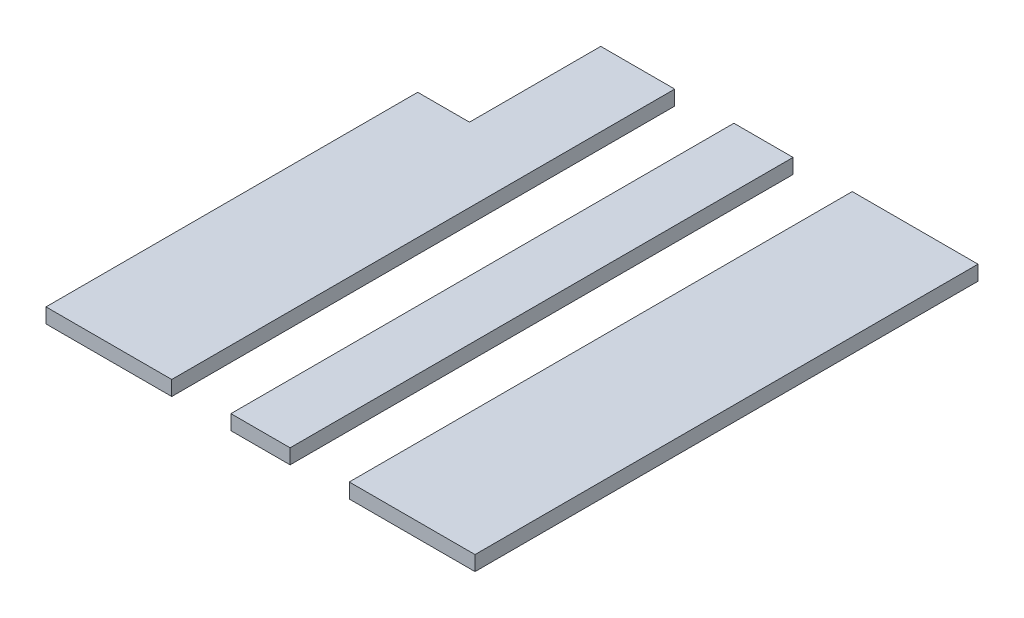
ISO-10303-21;
HEADER;
FILE_DESCRIPTION(('STEP AP214'),'2;1');
FILE_NAME('part.step','',(''),(''),'','','');
FILE_SCHEMA(('AUTOMOTIVE_DESIGN { 1 0 10303 214 1 1 1 1 }'));
ENDSEC;
DATA;
#1=APPLICATION_CONTEXT('core data for automotive mechanical design processes');
#2=APPLICATION_PROTOCOL_DEFINITION('international standard','automotive_design',2000,#1);
#3=PRODUCT_CONTEXT('',#1,'mechanical');
#4=PRODUCT('Part','Part','',(#3));
#5=PRODUCT_RELATED_PRODUCT_CATEGORY('part','',(#4));
#6=PRODUCT_DEFINITION_FORMATION('','',#4);
#7=PRODUCT_DEFINITION_CONTEXT('part definition',#1,'design');
#8=PRODUCT_DEFINITION('design','',#6,#7);
#9=PRODUCT_DEFINITION_SHAPE('','',#8);
#10=(LENGTH_UNIT() NAMED_UNIT(*) SI_UNIT(.MILLI.,.METRE.));
#11=(NAMED_UNIT(*) PLANE_ANGLE_UNIT() SI_UNIT($,.RADIAN.));
#12=(NAMED_UNIT(*) SI_UNIT($,.STERADIAN.) SOLID_ANGLE_UNIT());
#13=UNCERTAINTY_MEASURE_WITH_UNIT(LENGTH_MEASURE(1.E-05),#10,'distance_accuracy_value','');
#14=(GEOMETRIC_REPRESENTATION_CONTEXT(3) GLOBAL_UNCERTAINTY_ASSIGNED_CONTEXT((#13)) GLOBAL_UNIT_ASSIGNED_CONTEXT((#10,
#11,#12)) REPRESENTATION_CONTEXT('',''));
#15=CARTESIAN_POINT('',(0.,0.,0.));
#16=DIRECTION('',(0.,0.,1.));
#17=DIRECTION('',(1.,0.,0.));
#18=AXIS2_PLACEMENT_3D('',#15,#16,#17);
#19=CARTESIAN_POINT('',(-180.975,12.7,-469.9));
#20=DIRECTION('',(0.,0.,1.));
#21=DIRECTION('',(1.,0.,0.));
#22=AXIS2_PLACEMENT_3D('',#19,#20,#21);
#23=PLANE('',#22);
#24=DIRECTION('',(0.,1.,0.));
#25=VECTOR('',#24,1.);
#26=CARTESIAN_POINT('',(25.4000000000001,12.7,-469.9));
#27=LINE('',#26,#25);
#28=CARTESIAN_POINT('',(25.4000000000001,0.,-469.9));
#29=VERTEX_POINT('',#28);
#30=CARTESIAN_POINT('',(25.4000000000001,12.7,-469.9));
#31=VERTEX_POINT('',#30);
#32=EDGE_CURVE('E12',#29,#31,#27,.T.);
#33=ORIENTED_EDGE('',*,*,#32,.F.);
#34=DIRECTION('',(-1.,0.,0.));
#35=VECTOR('',#34,1.);
#36=CARTESIAN_POINT('',(-180.975,0.,-469.9));
#37=LINE('',#36,#35);
#38=CARTESIAN_POINT('',(-25.4000000000002,0.,-469.9));
#39=VERTEX_POINT('',#38);
#40=EDGE_CURVE('E100',#29,#39,#37,.T.);
#41=ORIENTED_EDGE('',*,*,#40,.T.);
#42=DIRECTION('',(0.,1.,0.));
#43=VECTOR('',#42,1.);
#44=CARTESIAN_POINT('',(-25.4000000000002,12.7,-469.9));
#45=LINE('',#44,#43);
#46=CARTESIAN_POINT('',(-25.4000000000002,12.7,-469.9));
#47=VERTEX_POINT('',#46);
#48=EDGE_CURVE('E92',#39,#47,#45,.T.);
#49=ORIENTED_EDGE('',*,*,#48,.T.);
#50=DIRECTION('',(-1.,0.,0.));
#51=VECTOR('',#50,1.);
#52=CARTESIAN_POINT('',(180.975,12.7,-469.9));
#53=LINE('',#52,#51);
#54=EDGE_CURVE('E87',#31,#47,#53,.T.);
#55=ORIENTED_EDGE('',*,*,#54,.F.);
#56=EDGE_LOOP('',(#33,#41,#49,#55));
#57=FACE_BOUND('',#56,.T.);
#58=ADVANCED_FACE('F41',(#57),#23,.F.);
#59=CARTESIAN_POINT('',(-231.560967647059,12.7,-38.1));
#60=DIRECTION('',(0.,0.,1.));
#61=DIRECTION('',(1.,0.,0.));
#62=AXIS2_PLACEMENT_3D('',#59,#60,#61);
#63=PLANE('',#62);
#64=DIRECTION('',(1.,0.,0.));
#65=VECTOR('',#64,1.);
#66=CARTESIAN_POINT('',(180.975,0.,-38.1));
#67=LINE('',#66,#65);
#68=CARTESIAN_POINT('',(-25.4000000000001,0.,-38.1));
#69=VERTEX_POINT('',#68);
#70=CARTESIAN_POINT('',(25.4000000000001,0.,-38.1));
#71=VERTEX_POINT('',#70);
#72=EDGE_CURVE('E98',#69,#71,#67,.T.);
#73=ORIENTED_EDGE('',*,*,#72,.T.);
#74=DIRECTION('',(0.,1.,0.));
#75=VECTOR('',#74,1.);
#76=CARTESIAN_POINT('',(25.4000000000001,12.7,-38.1));
#77=LINE('',#76,#75);
#78=CARTESIAN_POINT('',(25.4000000000001,12.7,-38.1));
#79=VERTEX_POINT('',#78);
#80=EDGE_CURVE('E61',#71,#79,#77,.T.);
#81=ORIENTED_EDGE('',*,*,#80,.T.);
#82=DIRECTION('',(-1.,0.,0.));
#83=VECTOR('',#82,1.);
#84=CARTESIAN_POINT('',(-231.560967647059,12.7,-38.1));
#85=LINE('',#84,#83);
#86=CARTESIAN_POINT('',(-25.4000000000001,12.7,-38.1));
#87=VERTEX_POINT('',#86);
#88=EDGE_CURVE('E44',#79,#87,#85,.T.);
#89=ORIENTED_EDGE('',*,*,#88,.T.);
#90=DIRECTION('',(0.,1.,0.));
#91=VECTOR('',#90,1.);
#92=CARTESIAN_POINT('',(-25.4000000000001,12.7,-38.1));
#93=LINE('',#92,#91);
#94=EDGE_CURVE('E49',#69,#87,#93,.T.);
#95=ORIENTED_EDGE('',*,*,#94,.F.);
#96=EDGE_LOOP('',(#73,#81,#89,#95));
#97=FACE_BOUND('',#96,.T.);
#98=ADVANCED_FACE('F111',(#97),#63,.T.);
#99=CARTESIAN_POINT('',(180.975,0.,-15.875));
#100=DIRECTION('',(0.,1.,0.));
#101=DIRECTION('',(0.,0.,1.));
#102=AXIS2_PLACEMENT_3D('',#99,#100,#101);
#103=PLANE('',#102);
#104=DIRECTION('',(0.,0.,1.));
#105=VECTOR('',#104,1.);
#106=CARTESIAN_POINT('',(25.4000000000001,0.,-486.780807022428));
#107=LINE('',#106,#105);
#108=EDGE_CURVE('E56',#29,#71,#107,.T.);
#109=ORIENTED_EDGE('',*,*,#108,.T.);
#110=ORIENTED_EDGE('',*,*,#72,.F.);
#111=DIRECTION('',(0.,0.,1.));
#112=VECTOR('',#111,1.);
#113=CARTESIAN_POINT('',(-25.4000000000002,0.,-486.780807022428));
#114=LINE('',#113,#112);
#115=EDGE_CURVE('E95',#39,#69,#114,.T.);
#116=ORIENTED_EDGE('',*,*,#115,.F.);
#117=ORIENTED_EDGE('',*,*,#40,.F.);
#118=EDGE_LOOP('',(#109,#110,#116,#117));
#119=FACE_BOUND('',#118,.T.);
#120=ADVANCED_FACE('F115',(#119),#103,.F.);
#121=CARTESIAN_POINT('',(180.975,12.7,-15.875));
#122=DIRECTION('',(0.,1.,0.));
#123=DIRECTION('',(0.,0.,1.));
#124=AXIS2_PLACEMENT_3D('',#121,#122,#123);
#125=PLANE('',#124);
#126=ORIENTED_EDGE('',*,*,#88,.F.);
#127=DIRECTION('',(0.,0.,-1.));
#128=VECTOR('',#127,1.);
#129=CARTESIAN_POINT('',(25.4000000000001,12.7,-15.875));
#130=LINE('',#129,#128);
#131=EDGE_CURVE('E79',#79,#31,#130,.T.);
#132=ORIENTED_EDGE('',*,*,#131,.T.);
#133=ORIENTED_EDGE('',*,*,#54,.T.);
#134=DIRECTION('',(0.,0.,1.));
#135=VECTOR('',#134,1.);
#136=CARTESIAN_POINT('',(-25.4000000000002,12.7,-486.780807022428));
#137=LINE('',#136,#135);
#138=EDGE_CURVE('E93',#47,#87,#137,.T.);
#139=ORIENTED_EDGE('',*,*,#138,.T.);
#140=EDGE_LOOP('',(#126,#132,#133,#139));
#141=FACE_BOUND('',#140,.T.);
#142=ADVANCED_FACE('F85',(#141),#125,.T.);
#143=CARTESIAN_POINT('',(-25.4000000000002,12.7,-486.780807022428));
#144=DIRECTION('',(1.,0.,0.));
#145=DIRECTION('',(0.,0.,-1.));
#146=AXIS2_PLACEMENT_3D('',#143,#144,#145);
#147=PLANE('',#146);
#148=ORIENTED_EDGE('',*,*,#115,.T.);
#149=ORIENTED_EDGE('',*,*,#94,.T.);
#150=ORIENTED_EDGE('',*,*,#138,.F.);
#151=ORIENTED_EDGE('',*,*,#48,.F.);
#152=EDGE_LOOP('',(#148,#149,#150,#151));
#153=FACE_BOUND('',#152,.T.);
#154=ADVANCED_FACE('F113',(#153),#147,.F.);
#155=CARTESIAN_POINT('',(25.4000000000001,12.7,-486.780807022428));
#156=DIRECTION('',(1.,0.,0.));
#157=DIRECTION('',(0.,0.,-1.));
#158=AXIS2_PLACEMENT_3D('',#155,#156,#157);
#159=PLANE('',#158);
#160=ORIENTED_EDGE('',*,*,#32,.T.);
#161=ORIENTED_EDGE('',*,*,#131,.F.);
#162=ORIENTED_EDGE('',*,*,#80,.F.);
#163=ORIENTED_EDGE('',*,*,#108,.F.);
#164=EDGE_LOOP('',(#160,#161,#162,#163));
#165=FACE_BOUND('',#164,.T.);
#166=ADVANCED_FACE('F78',(#165),#159,.T.);
#167=CLOSED_SHELL('',(#58,#98,#120,#142,#154,#166));
#168=MANIFOLD_SOLID_BREP('B2',#167);
#169=CARTESIAN_POINT('',(180.975,12.7,-15.875));
#170=DIRECTION('',(0.,1.,0.));
#171=DIRECTION('',(0.,0.,1.));
#172=AXIS2_PLACEMENT_3D('',#169,#170,#171);
#173=PLANE('',#172);
#174=DIRECTION('',(0.,0.,1.));
#175=VECTOR('',#174,1.);
#176=CARTESIAN_POINT('',(-139.7,12.7,-15.875));
#177=LINE('',#176,#175);
#178=CARTESIAN_POINT('',(-139.7,12.7000000000003,-469.9));
#179=VERTEX_POINT('',#178);
#180=CARTESIAN_POINT('',(-139.7,12.7000000000003,-357.2002));
#181=VERTEX_POINT('',#180);
#182=EDGE_CURVE('E243',#179,#181,#177,.T.);
#183=ORIENTED_EDGE('',*,*,#182,.T.);
#184=DIRECTION('',(1.,0.,0.));
#185=VECTOR('',#184,1.);
#186=CARTESIAN_POINT('',(-203.365160902219,12.7,-357.2002));
#187=LINE('',#186,#185);
#188=CARTESIAN_POINT('',(-184.15,12.7,-357.2002));
#189=VERTEX_POINT('',#188);
#190=EDGE_CURVE('E230',#189,#181,#187,.T.);
#191=ORIENTED_EDGE('',*,*,#190,.F.);
#192=DIRECTION('',(0.,0.,1.));
#193=VECTOR('',#192,1.);
#194=CARTESIAN_POINT('',(-184.15,12.7,-466.725));
#195=LINE('',#194,#193);
#196=CARTESIAN_POINT('',(-184.15,12.7,-38.1));
#197=VERTEX_POINT('',#196);
#198=EDGE_CURVE('E265',#189,#197,#195,.T.);
#199=ORIENTED_EDGE('',*,*,#198,.T.);
#200=DIRECTION('',(-1.,0.,0.));
#201=VECTOR('',#200,1.);
#202=CARTESIAN_POINT('',(-231.560967647059,12.7,-38.1));
#203=LINE('',#202,#201);
#204=CARTESIAN_POINT('',(-76.2,12.7,-38.1));
#205=VERTEX_POINT('',#204);
#206=EDGE_CURVE('E182',#205,#197,#203,.T.);
#207=ORIENTED_EDGE('',*,*,#206,.F.);
#208=DIRECTION('',(0.,0.,1.));
#209=VECTOR('',#208,1.);
#210=CARTESIAN_POINT('',(-76.2,12.7,-486.780807022428));
#211=LINE('',#210,#209);
#212=CARTESIAN_POINT('',(-76.2,12.7,-469.9));
#213=VERTEX_POINT('',#212);
#214=EDGE_CURVE('E39',#213,#205,#211,.T.);
#215=ORIENTED_EDGE('',*,*,#214,.F.);
#216=DIRECTION('',(-1.,0.,0.));
#217=VECTOR('',#216,1.);
#218=CARTESIAN_POINT('',(180.975,12.7,-469.9));
#219=LINE('',#218,#217);
#220=EDGE_CURVE('E246',#213,#179,#219,.T.);
#221=ORIENTED_EDGE('',*,*,#220,.T.);
#222=EDGE_LOOP('',(#183,#191,#199,#207,#215,#221));
#223=FACE_BOUND('',#222,.T.);
#224=ADVANCED_FACE('F179',(#223),#173,.T.);
#225=CARTESIAN_POINT('',(180.975,0.,-15.875));
#226=DIRECTION('',(0.,1.,0.));
#227=DIRECTION('',(0.,0.,1.));
#228=AXIS2_PLACEMENT_3D('',#225,#226,#227);
#229=PLANE('',#228);
#230=DIRECTION('',(-1.,0.,0.));
#231=VECTOR('',#230,1.);
#232=CARTESIAN_POINT('',(180.975,0.,-357.2002));
#233=LINE('',#232,#231);
#234=CARTESIAN_POINT('',(-139.7,2.22044604925031E-13,-357.2002));
#235=VERTEX_POINT('',#234);
#236=CARTESIAN_POINT('',(-184.15,0.,-357.2002));
#237=VERTEX_POINT('',#236);
#238=EDGE_CURVE('E240',#235,#237,#233,.T.);
#239=ORIENTED_EDGE('',*,*,#238,.F.);
#240=DIRECTION('',(0.,0.,1.));
#241=VECTOR('',#240,1.);
#242=CARTESIAN_POINT('',(-139.7,0.,-15.875));
#243=LINE('',#242,#241);
#244=CARTESIAN_POINT('',(-139.7,2.22044604925031E-13,-469.9));
#245=VERTEX_POINT('',#244);
#246=EDGE_CURVE('E249',#245,#235,#243,.T.);
#247=ORIENTED_EDGE('',*,*,#246,.F.);
#248=DIRECTION('',(-1.,0.,0.));
#249=VECTOR('',#248,1.);
#250=CARTESIAN_POINT('',(-180.975,0.,-469.9));
#251=LINE('',#250,#249);
#252=CARTESIAN_POINT('',(-76.2,0.,-469.9));
#253=VERTEX_POINT('',#252);
#254=EDGE_CURVE('E271',#253,#245,#251,.T.);
#255=ORIENTED_EDGE('',*,*,#254,.F.);
#256=DIRECTION('',(0.,0.,1.));
#257=VECTOR('',#256,1.);
#258=CARTESIAN_POINT('',(-76.2,0.,-486.780807022428));
#259=LINE('',#258,#257);
#260=CARTESIAN_POINT('',(-76.1999999999999,0.,-38.1));
#261=VERTEX_POINT('',#260);
#262=EDGE_CURVE('E195',#253,#261,#259,.T.);
#263=ORIENTED_EDGE('',*,*,#262,.T.);
#264=DIRECTION('',(1.,0.,0.));
#265=VECTOR('',#264,1.);
#266=CARTESIAN_POINT('',(180.975,0.,-38.1));
#267=LINE('',#266,#265);
#268=CARTESIAN_POINT('',(-184.15,0.,-38.1000000000001));
#269=VERTEX_POINT('',#268);
#270=EDGE_CURVE('E260',#269,#261,#267,.T.);
#271=ORIENTED_EDGE('',*,*,#270,.F.);
#272=DIRECTION('',(0.,0.,1.));
#273=VECTOR('',#272,1.);
#274=CARTESIAN_POINT('',(-184.15,0.,-466.725));
#275=LINE('',#274,#273);
#276=EDGE_CURVE('E262',#237,#269,#275,.T.);
#277=ORIENTED_EDGE('',*,*,#276,.F.);
#278=EDGE_LOOP('',(#239,#247,#255,#263,#271,#277));
#279=FACE_BOUND('',#278,.T.);
#280=ADVANCED_FACE('F280',(#279),#229,.F.);
#281=CARTESIAN_POINT('',(-180.975,12.7,-469.9));
#282=DIRECTION('',(0.,0.,1.));
#283=DIRECTION('',(1.,0.,0.));
#284=AXIS2_PLACEMENT_3D('',#281,#282,#283);
#285=PLANE('',#284);
#286=DIRECTION('',(0.,-1.,0.));
#287=VECTOR('',#286,1.);
#288=CARTESIAN_POINT('',(-139.7,738.171518276408,-469.9));
#289=LINE('',#288,#287);
#290=EDGE_CURVE('E254',#179,#245,#289,.T.);
#291=ORIENTED_EDGE('',*,*,#290,.F.);
#292=ORIENTED_EDGE('',*,*,#220,.F.);
#293=DIRECTION('',(0.,1.,0.));
#294=VECTOR('',#293,1.);
#295=CARTESIAN_POINT('',(-76.2,12.7,-469.9));
#296=LINE('',#295,#294);
#297=EDGE_CURVE('E187',#253,#213,#296,.T.);
#298=ORIENTED_EDGE('',*,*,#297,.F.);
#299=ORIENTED_EDGE('',*,*,#254,.T.);
#300=EDGE_LOOP('',(#291,#292,#298,#299));
#301=FACE_BOUND('',#300,.T.);
#302=ADVANCED_FACE('F278',(#301),#285,.F.);
#303=CARTESIAN_POINT('',(-231.560967647059,12.7,-38.1));
#304=DIRECTION('',(0.,0.,1.));
#305=DIRECTION('',(1.,0.,0.));
#306=AXIS2_PLACEMENT_3D('',#303,#304,#305);
#307=PLANE('',#306);
#308=ORIENTED_EDGE('',*,*,#270,.T.);
#309=DIRECTION('',(0.,1.,0.));
#310=VECTOR('',#309,1.);
#311=CARTESIAN_POINT('',(-76.1999999999999,12.7,-38.1));
#312=LINE('',#311,#310);
#313=EDGE_CURVE('E199',#261,#205,#312,.T.);
#314=ORIENTED_EDGE('',*,*,#313,.T.);
#315=ORIENTED_EDGE('',*,*,#206,.T.);
#316=DIRECTION('',(0.,-1.,0.));
#317=VECTOR('',#316,1.);
#318=CARTESIAN_POINT('',(-184.15,12.7,-38.1));
#319=LINE('',#318,#317);
#320=EDGE_CURVE('E264',#197,#269,#319,.T.);
#321=ORIENTED_EDGE('',*,*,#320,.T.);
#322=EDGE_LOOP('',(#308,#314,#315,#321));
#323=FACE_BOUND('',#322,.T.);
#324=ADVANCED_FACE('F288',(#323),#307,.T.);
#325=CARTESIAN_POINT('',(-184.15,12.7,-466.725));
#326=DIRECTION('',(1.,0.,0.));
#327=DIRECTION('',(0.,0.,-1.));
#328=AXIS2_PLACEMENT_3D('',#325,#326,#327);
#329=PLANE('',#328);
#330=DIRECTION('',(0.,1.,0.));
#331=VECTOR('',#330,1.);
#332=CARTESIAN_POINT('',(-184.15,12.7,-357.2002));
#333=LINE('',#332,#331);
#334=EDGE_CURVE('E236',#237,#189,#333,.T.);
#335=ORIENTED_EDGE('',*,*,#334,.F.);
#336=ORIENTED_EDGE('',*,*,#276,.T.);
#337=ORIENTED_EDGE('',*,*,#320,.F.);
#338=ORIENTED_EDGE('',*,*,#198,.F.);
#339=EDGE_LOOP('',(#335,#336,#337,#338));
#340=FACE_BOUND('',#339,.T.);
#341=ADVANCED_FACE('F284',(#340),#329,.F.);
#342=CARTESIAN_POINT('',(-203.365160902219,12.7,-357.2002));
#343=DIRECTION('',(0.,0.,-1.));
#344=DIRECTION('',(-1.,0.,0.));
#345=AXIS2_PLACEMENT_3D('',#342,#343,#344);
#346=PLANE('',#345);
#347=ORIENTED_EDGE('',*,*,#334,.T.);
#348=ORIENTED_EDGE('',*,*,#190,.T.);
#349=DIRECTION('',(0.,-1.,0.));
#350=VECTOR('',#349,1.);
#351=CARTESIAN_POINT('',(-139.7,738.171518276408,-357.2002));
#352=LINE('',#351,#350);
#353=EDGE_CURVE('E234',#181,#235,#352,.T.);
#354=ORIENTED_EDGE('',*,*,#353,.T.);
#355=ORIENTED_EDGE('',*,*,#238,.T.);
#356=EDGE_LOOP('',(#347,#348,#354,#355));
#357=FACE_BOUND('',#356,.T.);
#358=ADVANCED_FACE('F232',(#357),#346,.T.);
#359=CARTESIAN_POINT('',(-76.2,12.7,-486.780807022428));
#360=DIRECTION('',(1.,0.,0.));
#361=DIRECTION('',(0.,0.,-1.));
#362=AXIS2_PLACEMENT_3D('',#359,#360,#361);
#363=PLANE('',#362);
#364=ORIENTED_EDGE('',*,*,#297,.T.);
#365=ORIENTED_EDGE('',*,*,#214,.T.);
#366=ORIENTED_EDGE('',*,*,#313,.F.);
#367=ORIENTED_EDGE('',*,*,#262,.F.);
#368=EDGE_LOOP('',(#364,#365,#366,#367));
#369=FACE_BOUND('',#368,.T.);
#370=ADVANCED_FACE('F317',(#369),#363,.T.);
#371=CARTESIAN_POINT('',(-139.7,738.171518276408,-357.2002));
#372=DIRECTION('',(-1.,0.,0.));
#373=DIRECTION('',(0.,0.,1.));
#374=AXIS2_PLACEMENT_3D('',#371,#372,#373);
#375=PLANE('',#374);
#376=ORIENTED_EDGE('',*,*,#182,.F.);
#377=ORIENTED_EDGE('',*,*,#290,.T.);
#378=ORIENTED_EDGE('',*,*,#246,.T.);
#379=ORIENTED_EDGE('',*,*,#353,.F.);
#380=EDGE_LOOP('',(#376,#377,#378,#379));
#381=FACE_BOUND('',#380,.T.);
#382=ADVANCED_FACE('F252',(#381),#375,.T.);
#383=CLOSED_SHELL('',(#224,#280,#302,#324,#341,#358,#370,#382));
#384=MANIFOLD_SOLID_BREP('B6',#383);
#385=CARTESIAN_POINT('',(184.15,12.7,-466.725));
#386=DIRECTION('',(-1.,0.,0.));
#387=DIRECTION('',(0.,0.,1.));
#388=AXIS2_PLACEMENT_3D('',#385,#386,#387);
#389=PLANE('',#388);
#390=DIRECTION('',(0.,1.,0.));
#391=VECTOR('',#390,1.);
#392=CARTESIAN_POINT('',(184.15,12.7,-38.1));
#393=LINE('',#392,#391);
#394=CARTESIAN_POINT('',(184.15,0.,-38.1));
#395=VERTEX_POINT('',#394);
#396=CARTESIAN_POINT('',(184.15,12.7,-38.1));
#397=VERTEX_POINT('',#396);
#398=EDGE_CURVE('E425',#395,#397,#393,.T.);
#399=ORIENTED_EDGE('',*,*,#398,.F.);
#400=DIRECTION('',(0.,0.,-1.));
#401=VECTOR('',#400,1.);
#402=CARTESIAN_POINT('',(184.15,0.,-466.725));
#403=LINE('',#402,#401);
#404=CARTESIAN_POINT('',(184.15,0.,-469.9));
#405=VERTEX_POINT('',#404);
#406=EDGE_CURVE('E424',#395,#405,#403,.T.);
#407=ORIENTED_EDGE('',*,*,#406,.T.);
#408=DIRECTION('',(0.,-1.,0.));
#409=VECTOR('',#408,1.);
#410=CARTESIAN_POINT('',(184.15,12.7,-469.9));
#411=LINE('',#410,#409);
#412=CARTESIAN_POINT('',(184.15,12.7,-469.9));
#413=VERTEX_POINT('',#412);
#414=EDGE_CURVE('E423',#413,#405,#411,.T.);
#415=ORIENTED_EDGE('',*,*,#414,.F.);
#416=DIRECTION('',(0.,0.,-1.));
#417=VECTOR('',#416,1.);
#418=CARTESIAN_POINT('',(184.15,12.7,-15.875));
#419=LINE('',#418,#417);
#420=EDGE_CURVE('E389',#397,#413,#419,.T.);
#421=ORIENTED_EDGE('',*,*,#420,.F.);
#422=EDGE_LOOP('',(#399,#407,#415,#421));
#423=FACE_BOUND('',#422,.T.);
#424=ADVANCED_FACE('F366',(#423),#389,.F.);
#425=CARTESIAN_POINT('',(180.975,12.7,-15.875));
#426=DIRECTION('',(0.,1.,0.));
#427=DIRECTION('',(0.,0.,1.));
#428=AXIS2_PLACEMENT_3D('',#425,#426,#427);
#429=PLANE('',#428);
#430=DIRECTION('',(0.,0.,-1.));
#431=VECTOR('',#430,1.);
#432=CARTESIAN_POINT('',(76.1999999999999,12.7,-15.875));
#433=LINE('',#432,#431);
#434=CARTESIAN_POINT('',(76.1999999999999,12.7,-38.1));
#435=VERTEX_POINT('',#434);
#436=CARTESIAN_POINT('',(76.1999999999999,12.7,-469.9));
#437=VERTEX_POINT('',#436);
#438=EDGE_CURVE('E177',#435,#437,#433,.T.);
#439=ORIENTED_EDGE('',*,*,#438,.F.);
#440=DIRECTION('',(-1.,0.,0.));
#441=VECTOR('',#440,1.);
#442=CARTESIAN_POINT('',(-231.560967647059,12.7,-38.1));
#443=LINE('',#442,#441);
#444=EDGE_CURVE('E413',#397,#435,#443,.T.);
#445=ORIENTED_EDGE('',*,*,#444,.F.);
#446=ORIENTED_EDGE('',*,*,#420,.T.);
#447=DIRECTION('',(-1.,0.,0.));
#448=VECTOR('',#447,1.);
#449=CARTESIAN_POINT('',(180.975,12.7,-469.9));
#450=LINE('',#449,#448);
#451=EDGE_CURVE('E427',#413,#437,#450,.T.);
#452=ORIENTED_EDGE('',*,*,#451,.T.);
#453=EDGE_LOOP('',(#439,#445,#446,#452));
#454=FACE_BOUND('',#453,.T.);
#455=ADVANCED_FACE('F440',(#454),#429,.T.);
#456=CARTESIAN_POINT('',(180.975,0.,-15.875));
#457=DIRECTION('',(0.,1.,0.));
#458=DIRECTION('',(0.,0.,1.));
#459=AXIS2_PLACEMENT_3D('',#456,#457,#458);
#460=PLANE('',#459);
#461=DIRECTION('',(1.,0.,0.));
#462=VECTOR('',#461,1.);
#463=CARTESIAN_POINT('',(180.975,0.,-38.1));
#464=LINE('',#463,#462);
#465=CARTESIAN_POINT('',(76.1999999999999,0.,-38.1));
#466=VERTEX_POINT('',#465);
#467=EDGE_CURVE('E374',#466,#395,#464,.T.);
#468=ORIENTED_EDGE('',*,*,#467,.F.);
#469=DIRECTION('',(0.,0.,1.));
#470=VECTOR('',#469,1.);
#471=CARTESIAN_POINT('',(76.1999999999999,0.,-486.780807022428));
#472=LINE('',#471,#470);
#473=CARTESIAN_POINT('',(76.1999999999999,0.,-469.9));
#474=VERTEX_POINT('',#473);
#475=EDGE_CURVE('E409',#474,#466,#472,.T.);
#476=ORIENTED_EDGE('',*,*,#475,.F.);
#477=DIRECTION('',(-1.,0.,0.));
#478=VECTOR('',#477,1.);
#479=CARTESIAN_POINT('',(-180.975,0.,-469.9));
#480=LINE('',#479,#478);
#481=EDGE_CURVE('E420',#405,#474,#480,.T.);
#482=ORIENTED_EDGE('',*,*,#481,.F.);
#483=ORIENTED_EDGE('',*,*,#406,.F.);
#484=EDGE_LOOP('',(#468,#476,#482,#483));
#485=FACE_BOUND('',#484,.T.);
#486=ADVANCED_FACE('F418',(#485),#460,.F.);
#487=CARTESIAN_POINT('',(-231.560967647059,12.7,-38.1));
#488=DIRECTION('',(0.,0.,1.));
#489=DIRECTION('',(1.,0.,0.));
#490=AXIS2_PLACEMENT_3D('',#487,#488,#489);
#491=PLANE('',#490);
#492=DIRECTION('',(0.,1.,0.));
#493=VECTOR('',#492,1.);
#494=CARTESIAN_POINT('',(76.1999999999999,12.7,-38.1));
#495=LINE('',#494,#493);
#496=EDGE_CURVE('E380',#466,#435,#495,.T.);
#497=ORIENTED_EDGE('',*,*,#496,.F.);
#498=ORIENTED_EDGE('',*,*,#467,.T.);
#499=ORIENTED_EDGE('',*,*,#398,.T.);
#500=ORIENTED_EDGE('',*,*,#444,.T.);
#501=EDGE_LOOP('',(#497,#498,#499,#500));
#502=FACE_BOUND('',#501,.T.);
#503=ADVANCED_FACE('F435',(#502),#491,.T.);
#504=CARTESIAN_POINT('',(-180.975,12.7,-469.9));
#505=DIRECTION('',(0.,0.,1.));
#506=DIRECTION('',(1.,0.,0.));
#507=AXIS2_PLACEMENT_3D('',#504,#505,#506);
#508=PLANE('',#507);
#509=ORIENTED_EDGE('',*,*,#481,.T.);
#510=DIRECTION('',(0.,1.,0.));
#511=VECTOR('',#510,1.);
#512=CARTESIAN_POINT('',(76.1999999999999,12.7,-469.9));
#513=LINE('',#512,#511);
#514=EDGE_CURVE('E406',#474,#437,#513,.T.);
#515=ORIENTED_EDGE('',*,*,#514,.T.);
#516=ORIENTED_EDGE('',*,*,#451,.F.);
#517=ORIENTED_EDGE('',*,*,#414,.T.);
#518=EDGE_LOOP('',(#509,#515,#516,#517));
#519=FACE_BOUND('',#518,.T.);
#520=ADVANCED_FACE('F368',(#519),#508,.F.);
#521=CARTESIAN_POINT('',(76.1999999999999,12.7,-486.780807022428));
#522=DIRECTION('',(1.,0.,0.));
#523=DIRECTION('',(0.,0.,-1.));
#524=AXIS2_PLACEMENT_3D('',#521,#522,#523);
#525=PLANE('',#524);
#526=ORIENTED_EDGE('',*,*,#475,.T.);
#527=ORIENTED_EDGE('',*,*,#496,.T.);
#528=ORIENTED_EDGE('',*,*,#438,.T.);
#529=ORIENTED_EDGE('',*,*,#514,.F.);
#530=EDGE_LOOP('',(#526,#527,#528,#529));
#531=FACE_BOUND('',#530,.T.);
#532=ADVANCED_FACE('F408',(#531),#525,.F.);
#533=CLOSED_SHELL('',(#424,#455,#486,#503,#520,#532));
#534=MANIFOLD_SOLID_BREP('B33',#533);
#535=ADVANCED_BREP_SHAPE_REPRESENTATION('',(#18,#168,#384,#534),#14);
#536=SHAPE_DEFINITION_REPRESENTATION(#9,#535);
ENDSEC;
END-ISO-10303-21;
